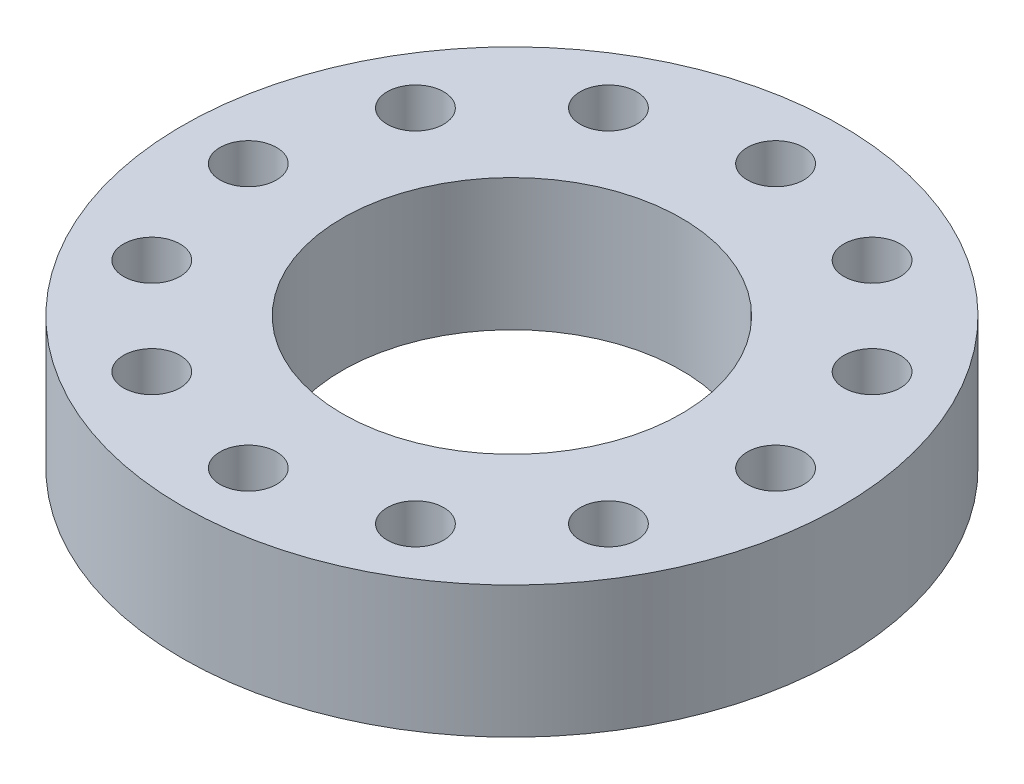
ISO-10303-21;
HEADER;
FILE_DESCRIPTION(('STEP AP214'),'2;1');
FILE_NAME('part.step','',(''),(''),'','','');
FILE_SCHEMA(('AUTOMOTIVE_DESIGN { 1 0 10303 214 1 1 1 1 }'));
ENDSEC;
DATA;
#1=APPLICATION_CONTEXT('core data for automotive mechanical design processes');
#2=APPLICATION_PROTOCOL_DEFINITION('international standard','automotive_design',2000,#1);
#3=PRODUCT_CONTEXT('',#1,'mechanical');
#4=PRODUCT('Part','Part','',(#3));
#5=PRODUCT_RELATED_PRODUCT_CATEGORY('part','',(#4));
#6=PRODUCT_DEFINITION_FORMATION('','',#4);
#7=PRODUCT_DEFINITION_CONTEXT('part definition',#1,'design');
#8=PRODUCT_DEFINITION('design','',#6,#7);
#9=PRODUCT_DEFINITION_SHAPE('','',#8);
#10=(LENGTH_UNIT() NAMED_UNIT(*) SI_UNIT(.MILLI.,.METRE.));
#11=(NAMED_UNIT(*) PLANE_ANGLE_UNIT() SI_UNIT($,.RADIAN.));
#12=(NAMED_UNIT(*) SI_UNIT($,.STERADIAN.) SOLID_ANGLE_UNIT());
#13=UNCERTAINTY_MEASURE_WITH_UNIT(LENGTH_MEASURE(1.E-05),#10,'distance_accuracy_value','');
#14=(GEOMETRIC_REPRESENTATION_CONTEXT(3) GLOBAL_UNCERTAINTY_ASSIGNED_CONTEXT((#13)) GLOBAL_UNIT_ASSIGNED_CONTEXT((#10,
#11,#12)) REPRESENTATION_CONTEXT('',''));
#15=CARTESIAN_POINT('',(0.,0.,0.));
#16=DIRECTION('',(0.,0.,1.));
#17=DIRECTION('',(1.,0.,0.));
#18=AXIS2_PLACEMENT_3D('',#15,#16,#17);
#19=CARTESIAN_POINT('',(0.,7.,0.));
#20=DIRECTION('',(0.,1.,0.));
#21=DIRECTION('',(0.,0.,1.));
#22=AXIS2_PLACEMENT_3D('',#19,#20,#21);
#23=PLANE('',#22);
#24=CARTESIAN_POINT('',(-12.1243556529818,7.,-6.99999999999942));
#25=DIRECTION('',(0.,1.,0.));
#26=DIRECTION('',(0.,0.,1.));
#27=AXIS2_PLACEMENT_3D('',#24,#25,#26);
#28=CIRCLE('',#27,1.5);
#29=CARTESIAN_POINT('',(-12.1243556529818,7.,-5.49999999999942));
#30=VERTEX_POINT('',#29);
#31=EDGE_CURVE('E107',#30,#30,#28,.T.);
#32=ORIENTED_EDGE('',*,*,#31,.F.);
#33=EDGE_LOOP('',(#32));
#34=FACE_BOUND('',#33,.T.);
#35=CARTESIAN_POINT('',(-12.1243556529812,7.,7.00000000000058));
#36=DIRECTION('',(0.,1.,0.));
#37=DIRECTION('',(0.,0.,1.));
#38=AXIS2_PLACEMENT_3D('',#35,#36,#37);
#39=CIRCLE('',#38,1.5);
#40=CARTESIAN_POINT('',(-12.1243556529812,7.,8.50000000000057));
#41=VERTEX_POINT('',#40);
#42=EDGE_CURVE('E95',#41,#41,#39,.T.);
#43=ORIENTED_EDGE('',*,*,#42,.F.);
#44=EDGE_LOOP('',(#43));
#45=FACE_BOUND('',#44,.T.);
#46=CARTESIAN_POINT('',(7.00000000000123,7.,12.1243556529818));
#47=DIRECTION('',(0.,1.,0.));
#48=DIRECTION('',(0.,0.,1.));
#49=AXIS2_PLACEMENT_3D('',#46,#47,#48);
#50=CIRCLE('',#49,1.5);
#51=CARTESIAN_POINT('',(7.00000000000123,7.,13.6243556529818));
#52=VERTEX_POINT('',#51);
#53=EDGE_CURVE('E83',#52,#52,#50,.T.);
#54=ORIENTED_EDGE('',*,*,#53,.F.);
#55=EDGE_LOOP('',(#54));
#56=FACE_BOUND('',#55,.T.);
#57=CARTESIAN_POINT('',(14.0000000000007,7.,-6.5786559193894E-13));
#58=DIRECTION('',(0.,1.,0.));
#59=DIRECTION('',(0.,0.,1.));
#60=AXIS2_PLACEMENT_3D('',#57,#58,#59);
#61=CIRCLE('',#60,1.5);
#62=CARTESIAN_POINT('',(14.0000000000007,7.,1.49999999999934));
#63=VERTEX_POINT('',#62);
#64=EDGE_CURVE('E71',#63,#63,#61,.T.);
#65=ORIENTED_EDGE('',*,*,#64,.F.);
#66=EDGE_LOOP('',(#65));
#67=FACE_BOUND('',#66,.T.);
#68=CARTESIAN_POINT('',(7.00000000000009,7.,-12.1243556529825));
#69=DIRECTION('',(0.,1.,0.));
#70=DIRECTION('',(0.,0.,1.));
#71=AXIS2_PLACEMENT_3D('',#68,#69,#70);
#72=CIRCLE('',#71,1.5);
#73=CARTESIAN_POINT('',(7.00000000000009,7.,-10.6243556529825));
#74=VERTEX_POINT('',#73);
#75=EDGE_CURVE('E59',#74,#74,#72,.T.);
#76=ORIENTED_EDGE('',*,*,#75,.F.);
#77=EDGE_LOOP('',(#76));
#78=FACE_BOUND('',#77,.T.);
#79=CARTESIAN_POINT('',(0.,7.,-14.));
#80=DIRECTION('',(0.,1.,0.));
#81=DIRECTION('',(0.,0.,1.));
#82=AXIS2_PLACEMENT_3D('',#79,#80,#81);
#83=CIRCLE('',#82,1.5);
#84=CARTESIAN_POINT('',(0.,7.,-12.5));
#85=VERTEX_POINT('',#84);
#86=EDGE_CURVE('E47',#85,#85,#83,.T.);
#87=ORIENTED_EDGE('',*,*,#86,.F.);
#88=EDGE_LOOP('',(#87));
#89=FACE_BOUND('',#88,.T.);
#90=CARTESIAN_POINT('',(0.,7.,0.));
#91=DIRECTION('',(0.,1.,0.));
#92=DIRECTION('',(0.,0.,1.));
#93=AXIS2_PLACEMENT_3D('',#90,#91,#92);
#94=CIRCLE('',#93,17.5);
#95=CARTESIAN_POINT('',(0.,7.,17.5));
#96=VERTEX_POINT('',#95);
#97=EDGE_CURVE('E10',#96,#96,#94,.T.);
#98=ORIENTED_EDGE('',*,*,#97,.T.);
#99=EDGE_LOOP('',(#98));
#100=FACE_BOUND('',#99,.T.);
#101=CARTESIAN_POINT('',(0.,7.,0.));
#102=DIRECTION('',(0.,1.,0.));
#103=DIRECTION('',(0.,0.,1.));
#104=AXIS2_PLACEMENT_3D('',#101,#102,#103);
#105=CIRCLE('',#104,9.);
#106=CARTESIAN_POINT('',(0.,7.,9.));
#107=VERTEX_POINT('',#106);
#108=EDGE_CURVE('E42',#107,#107,#105,.T.);
#109=ORIENTED_EDGE('',*,*,#108,.F.);
#110=EDGE_LOOP('',(#109));
#111=FACE_BOUND('',#110,.T.);
#112=CARTESIAN_POINT('',(1.31573118387788E-12,7.,14.));
#113=DIRECTION('',(0.,1.,0.));
#114=DIRECTION('',(0.,0.,1.));
#115=AXIS2_PLACEMENT_3D('',#112,#113,#114);
#116=CIRCLE('',#115,1.5);
#117=CARTESIAN_POINT('',(1.31573118387788E-12,7.,15.5));
#118=VERTEX_POINT('',#117);
#119=EDGE_CURVE('E53',#118,#118,#116,.T.);
#120=ORIENTED_EDGE('',*,*,#119,.F.);
#121=EDGE_LOOP('',(#120));
#122=FACE_BOUND('',#121,.T.);
#123=CARTESIAN_POINT('',(12.1243556529825,7.,-7.00000000000057));
#124=DIRECTION('',(0.,1.,0.));
#125=DIRECTION('',(0.,0.,1.));
#126=AXIS2_PLACEMENT_3D('',#123,#124,#125);
#127=CIRCLE('',#126,1.5);
#128=CARTESIAN_POINT('',(12.1243556529825,7.,-5.50000000000057));
#129=VERTEX_POINT('',#128);
#130=EDGE_CURVE('E65',#129,#129,#127,.T.);
#131=ORIENTED_EDGE('',*,*,#130,.F.);
#132=EDGE_LOOP('',(#131));
#133=FACE_BOUND('',#132,.T.);
#134=CARTESIAN_POINT('',(12.1243556529831,7.,6.99999999999943));
#135=DIRECTION('',(0.,1.,0.));
#136=DIRECTION('',(0.,0.,1.));
#137=AXIS2_PLACEMENT_3D('',#134,#135,#136);
#138=CIRCLE('',#137,1.5);
#139=CARTESIAN_POINT('',(12.1243556529831,7.,8.49999999999942));
#140=VERTEX_POINT('',#139);
#141=EDGE_CURVE('E77',#140,#140,#138,.T.);
#142=ORIENTED_EDGE('',*,*,#141,.F.);
#143=EDGE_LOOP('',(#142));
#144=FACE_BOUND('',#143,.T.);
#145=CARTESIAN_POINT('',(-6.99999999999877,7.,12.1243556529825));
#146=DIRECTION('',(0.,1.,0.));
#147=DIRECTION('',(0.,0.,1.));
#148=AXIS2_PLACEMENT_3D('',#145,#146,#147);
#149=CIRCLE('',#148,1.5);
#150=CARTESIAN_POINT('',(-6.99999999999877,7.,13.6243556529825));
#151=VERTEX_POINT('',#150);
#152=EDGE_CURVE('E89',#151,#151,#149,.T.);
#153=ORIENTED_EDGE('',*,*,#152,.F.);
#154=EDGE_LOOP('',(#153));
#155=FACE_BOUND('',#154,.T.);
#156=CARTESIAN_POINT('',(-13.9999999999993,7.,6.59580097457746E-13));
#157=DIRECTION('',(0.,1.,0.));
#158=DIRECTION('',(0.,0.,1.));
#159=AXIS2_PLACEMENT_3D('',#156,#157,#158);
#160=CIRCLE('',#159,1.5);
#161=CARTESIAN_POINT('',(-13.9999999999993,7.,1.50000000000066));
#162=VERTEX_POINT('',#161);
#163=EDGE_CURVE('E101',#162,#162,#160,.T.);
#164=ORIENTED_EDGE('',*,*,#163,.F.);
#165=EDGE_LOOP('',(#164));
#166=FACE_BOUND('',#165,.T.);
#167=CARTESIAN_POINT('',(-6.99999999999992,7.,-12.1243556529818));
#168=DIRECTION('',(0.,1.,0.));
#169=DIRECTION('',(0.,0.,1.));
#170=AXIS2_PLACEMENT_3D('',#167,#168,#169);
#171=CIRCLE('',#170,1.5);
#172=CARTESIAN_POINT('',(-6.99999999999992,7.,-10.6243556529818));
#173=VERTEX_POINT('',#172);
#174=EDGE_CURVE('E113',#173,#173,#171,.T.);
#175=ORIENTED_EDGE('',*,*,#174,.F.);
#176=EDGE_LOOP('',(#175));
#177=FACE_BOUND('',#176,.T.);
#178=ADVANCED_FACE('F31',(#34,#45,#56,#67,#78,#89,#100,#111,#122,#133,#144,#155,#166,#177),#23,.T.);
#179=CARTESIAN_POINT('',(0.,0.,0.));
#180=DIRECTION('',(0.,1.,0.));
#181=DIRECTION('',(0.,0.,1.));
#182=AXIS2_PLACEMENT_3D('',#179,#180,#181);
#183=PLANE('',#182);
#184=CARTESIAN_POINT('',(0.,0.,0.));
#185=DIRECTION('',(0.,1.,0.));
#186=DIRECTION('',(0.,0.,1.));
#187=AXIS2_PLACEMENT_3D('',#184,#185,#186);
#188=CIRCLE('',#187,17.5);
#189=CARTESIAN_POINT('',(0.,0.,17.5));
#190=VERTEX_POINT('',#189);
#191=EDGE_CURVE('E35',#190,#190,#188,.T.);
#192=ORIENTED_EDGE('',*,*,#191,.F.);
#193=EDGE_LOOP('',(#192));
#194=FACE_BOUND('',#193,.T.);
#195=CARTESIAN_POINT('',(0.,0.,0.));
#196=DIRECTION('',(0.,1.,0.));
#197=DIRECTION('',(0.,0.,1.));
#198=AXIS2_PLACEMENT_3D('',#195,#196,#197);
#199=CIRCLE('',#198,9.);
#200=CARTESIAN_POINT('',(0.,0.,9.));
#201=VERTEX_POINT('',#200);
#202=EDGE_CURVE('E44',#201,#201,#199,.T.);
#203=ORIENTED_EDGE('',*,*,#202,.T.);
#204=EDGE_LOOP('',(#203));
#205=FACE_BOUND('',#204,.T.);
#206=CARTESIAN_POINT('',(0.,0.,-14.));
#207=DIRECTION('',(0.,1.,0.));
#208=DIRECTION('',(0.,0.,1.));
#209=AXIS2_PLACEMENT_3D('',#206,#207,#208);
#210=CIRCLE('',#209,1.5);
#211=CARTESIAN_POINT('',(0.,0.,-12.5));
#212=VERTEX_POINT('',#211);
#213=EDGE_CURVE('E50',#212,#212,#210,.T.);
#214=ORIENTED_EDGE('',*,*,#213,.T.);
#215=EDGE_LOOP('',(#214));
#216=FACE_BOUND('',#215,.T.);
#217=CARTESIAN_POINT('',(1.31573118387788E-12,0.,14.));
#218=DIRECTION('',(0.,1.,0.));
#219=DIRECTION('',(0.,0.,1.));
#220=AXIS2_PLACEMENT_3D('',#217,#218,#219);
#221=CIRCLE('',#220,1.5);
#222=CARTESIAN_POINT('',(1.31573118387788E-12,0.,15.5));
#223=VERTEX_POINT('',#222);
#224=EDGE_CURVE('E56',#223,#223,#221,.T.);
#225=ORIENTED_EDGE('',*,*,#224,.T.);
#226=EDGE_LOOP('',(#225));
#227=FACE_BOUND('',#226,.T.);
#228=CARTESIAN_POINT('',(7.00000000000009,0.,-12.1243556529825));
#229=DIRECTION('',(0.,1.,0.));
#230=DIRECTION('',(0.,0.,1.));
#231=AXIS2_PLACEMENT_3D('',#228,#229,#230);
#232=CIRCLE('',#231,1.5);
#233=CARTESIAN_POINT('',(7.00000000000009,0.,-10.6243556529825));
#234=VERTEX_POINT('',#233);
#235=EDGE_CURVE('E62',#234,#234,#232,.T.);
#236=ORIENTED_EDGE('',*,*,#235,.T.);
#237=EDGE_LOOP('',(#236));
#238=FACE_BOUND('',#237,.T.);
#239=CARTESIAN_POINT('',(12.1243556529825,0.,-7.00000000000057));
#240=DIRECTION('',(0.,1.,0.));
#241=DIRECTION('',(0.,0.,1.));
#242=AXIS2_PLACEMENT_3D('',#239,#240,#241);
#243=CIRCLE('',#242,1.5);
#244=CARTESIAN_POINT('',(12.1243556529825,0.,-5.50000000000057));
#245=VERTEX_POINT('',#244);
#246=EDGE_CURVE('E68',#245,#245,#243,.T.);
#247=ORIENTED_EDGE('',*,*,#246,.T.);
#248=EDGE_LOOP('',(#247));
#249=FACE_BOUND('',#248,.T.);
#250=CARTESIAN_POINT('',(14.0000000000007,0.,-6.5786559193894E-13));
#251=DIRECTION('',(0.,1.,0.));
#252=DIRECTION('',(0.,0.,1.));
#253=AXIS2_PLACEMENT_3D('',#250,#251,#252);
#254=CIRCLE('',#253,1.5);
#255=CARTESIAN_POINT('',(14.0000000000007,0.,1.49999999999934));
#256=VERTEX_POINT('',#255);
#257=EDGE_CURVE('E74',#256,#256,#254,.T.);
#258=ORIENTED_EDGE('',*,*,#257,.T.);
#259=EDGE_LOOP('',(#258));
#260=FACE_BOUND('',#259,.T.);
#261=CARTESIAN_POINT('',(12.1243556529831,0.,6.99999999999943));
#262=DIRECTION('',(0.,1.,0.));
#263=DIRECTION('',(0.,0.,1.));
#264=AXIS2_PLACEMENT_3D('',#261,#262,#263);
#265=CIRCLE('',#264,1.5);
#266=CARTESIAN_POINT('',(12.1243556529831,0.,8.49999999999942));
#267=VERTEX_POINT('',#266);
#268=EDGE_CURVE('E80',#267,#267,#265,.T.);
#269=ORIENTED_EDGE('',*,*,#268,.T.);
#270=EDGE_LOOP('',(#269));
#271=FACE_BOUND('',#270,.T.);
#272=CARTESIAN_POINT('',(7.00000000000123,0.,12.1243556529818));
#273=DIRECTION('',(0.,1.,0.));
#274=DIRECTION('',(0.,0.,1.));
#275=AXIS2_PLACEMENT_3D('',#272,#273,#274);
#276=CIRCLE('',#275,1.5);
#277=CARTESIAN_POINT('',(7.00000000000123,0.,13.6243556529818));
#278=VERTEX_POINT('',#277);
#279=EDGE_CURVE('E86',#278,#278,#276,.T.);
#280=ORIENTED_EDGE('',*,*,#279,.T.);
#281=EDGE_LOOP('',(#280));
#282=FACE_BOUND('',#281,.T.);
#283=CARTESIAN_POINT('',(-6.99999999999877,0.,12.1243556529825));
#284=DIRECTION('',(0.,1.,0.));
#285=DIRECTION('',(0.,0.,1.));
#286=AXIS2_PLACEMENT_3D('',#283,#284,#285);
#287=CIRCLE('',#286,1.5);
#288=CARTESIAN_POINT('',(-6.99999999999877,0.,13.6243556529825));
#289=VERTEX_POINT('',#288);
#290=EDGE_CURVE('E92',#289,#289,#287,.T.);
#291=ORIENTED_EDGE('',*,*,#290,.T.);
#292=EDGE_LOOP('',(#291));
#293=FACE_BOUND('',#292,.T.);
#294=CARTESIAN_POINT('',(-12.1243556529812,0.,7.00000000000058));
#295=DIRECTION('',(0.,1.,0.));
#296=DIRECTION('',(0.,0.,1.));
#297=AXIS2_PLACEMENT_3D('',#294,#295,#296);
#298=CIRCLE('',#297,1.5);
#299=CARTESIAN_POINT('',(-12.1243556529812,0.,8.50000000000057));
#300=VERTEX_POINT('',#299);
#301=EDGE_CURVE('E98',#300,#300,#298,.T.);
#302=ORIENTED_EDGE('',*,*,#301,.T.);
#303=EDGE_LOOP('',(#302));
#304=FACE_BOUND('',#303,.T.);
#305=CARTESIAN_POINT('',(-13.9999999999993,0.,6.59580097457746E-13));
#306=DIRECTION('',(0.,1.,0.));
#307=DIRECTION('',(0.,0.,1.));
#308=AXIS2_PLACEMENT_3D('',#305,#306,#307);
#309=CIRCLE('',#308,1.5);
#310=CARTESIAN_POINT('',(-13.9999999999993,0.,1.50000000000066));
#311=VERTEX_POINT('',#310);
#312=EDGE_CURVE('E104',#311,#311,#309,.T.);
#313=ORIENTED_EDGE('',*,*,#312,.T.);
#314=EDGE_LOOP('',(#313));
#315=FACE_BOUND('',#314,.T.);
#316=CARTESIAN_POINT('',(-12.1243556529818,0.,-6.99999999999942));
#317=DIRECTION('',(0.,1.,0.));
#318=DIRECTION('',(0.,0.,1.));
#319=AXIS2_PLACEMENT_3D('',#316,#317,#318);
#320=CIRCLE('',#319,1.5);
#321=CARTESIAN_POINT('',(-12.1243556529818,0.,-5.49999999999942));
#322=VERTEX_POINT('',#321);
#323=EDGE_CURVE('E110',#322,#322,#320,.T.);
#324=ORIENTED_EDGE('',*,*,#323,.T.);
#325=EDGE_LOOP('',(#324));
#326=FACE_BOUND('',#325,.T.);
#327=CARTESIAN_POINT('',(-6.99999999999992,0.,-12.1243556529818));
#328=DIRECTION('',(0.,1.,0.));
#329=DIRECTION('',(0.,0.,1.));
#330=AXIS2_PLACEMENT_3D('',#327,#328,#329);
#331=CIRCLE('',#330,1.5);
#332=CARTESIAN_POINT('',(-6.99999999999992,0.,-10.6243556529818));
#333=VERTEX_POINT('',#332);
#334=EDGE_CURVE('E116',#333,#333,#331,.T.);
#335=ORIENTED_EDGE('',*,*,#334,.T.);
#336=EDGE_LOOP('',(#335));
#337=FACE_BOUND('',#336,.T.);
#338=ADVANCED_FACE('F126',(#194,#205,#216,#227,#238,#249,#260,#271,#282,#293,#304,#315,#326,
#337),#183,.F.);
#339=CARTESIAN_POINT('',(0.,7.,0.));
#340=DIRECTION('',(0.,-1.,0.));
#341=DIRECTION('',(0.,0.,-1.));
#342=AXIS2_PLACEMENT_3D('',#339,#340,#341);
#343=CYLINDRICAL_SURFACE('',#342,17.5);
#344=ORIENTED_EDGE('',*,*,#97,.F.);
#345=EDGE_LOOP('',(#344));
#346=FACE_BOUND('',#345,.T.);
#347=ORIENTED_EDGE('',*,*,#191,.T.);
#348=EDGE_LOOP('',(#347));
#349=FACE_BOUND('',#348,.T.);
#350=ADVANCED_FACE('F33',(#346,#349),#343,.T.);
#351=CARTESIAN_POINT('',(0.,7.,0.));
#352=DIRECTION('',(0.,-1.,0.));
#353=DIRECTION('',(0.,0.,-1.));
#354=AXIS2_PLACEMENT_3D('',#351,#352,#353);
#355=CYLINDRICAL_SURFACE('',#354,9.);
#356=ORIENTED_EDGE('',*,*,#108,.T.);
#357=EDGE_LOOP('',(#356));
#358=FACE_BOUND('',#357,.T.);
#359=ORIENTED_EDGE('',*,*,#202,.F.);
#360=EDGE_LOOP('',(#359));
#361=FACE_BOUND('',#360,.T.);
#362=ADVANCED_FACE('F136',(#358,#361),#355,.F.);
#363=CARTESIAN_POINT('',(0.,7.,-14.));
#364=DIRECTION('',(0.,-1.,0.));
#365=DIRECTION('',(0.,0.,-1.));
#366=AXIS2_PLACEMENT_3D('',#363,#364,#365);
#367=CYLINDRICAL_SURFACE('',#366,1.5);
#368=ORIENTED_EDGE('',*,*,#86,.T.);
#369=EDGE_LOOP('',(#368));
#370=FACE_BOUND('',#369,.T.);
#371=ORIENTED_EDGE('',*,*,#213,.F.);
#372=EDGE_LOOP('',(#371));
#373=FACE_BOUND('',#372,.T.);
#374=ADVANCED_FACE('F139',(#370,#373),#367,.F.);
#375=CARTESIAN_POINT('',(1.31573118387788E-12,7.,14.));
#376=DIRECTION('',(0.,-1.,0.));
#377=DIRECTION('',(0.,0.,-1.));
#378=AXIS2_PLACEMENT_3D('',#375,#376,#377);
#379=CYLINDRICAL_SURFACE('',#378,1.5);
#380=ORIENTED_EDGE('',*,*,#119,.T.);
#381=EDGE_LOOP('',(#380));
#382=FACE_BOUND('',#381,.T.);
#383=ORIENTED_EDGE('',*,*,#224,.F.);
#384=EDGE_LOOP('',(#383));
#385=FACE_BOUND('',#384,.T.);
#386=ADVANCED_FACE('F143',(#382,#385),#379,.F.);
#387=CARTESIAN_POINT('',(7.00000000000009,7.,-12.1243556529825));
#388=DIRECTION('',(0.,-1.,0.));
#389=DIRECTION('',(0.,0.,-1.));
#390=AXIS2_PLACEMENT_3D('',#387,#388,#389);
#391=CYLINDRICAL_SURFACE('',#390,1.5);
#392=ORIENTED_EDGE('',*,*,#75,.T.);
#393=EDGE_LOOP('',(#392));
#394=FACE_BOUND('',#393,.T.);
#395=ORIENTED_EDGE('',*,*,#235,.F.);
#396=EDGE_LOOP('',(#395));
#397=FACE_BOUND('',#396,.T.);
#398=ADVANCED_FACE('F147',(#394,#397),#391,.F.);
#399=CARTESIAN_POINT('',(12.1243556529825,7.,-7.00000000000057));
#400=DIRECTION('',(0.,-1.,0.));
#401=DIRECTION('',(0.,0.,-1.));
#402=AXIS2_PLACEMENT_3D('',#399,#400,#401);
#403=CYLINDRICAL_SURFACE('',#402,1.5);
#404=ORIENTED_EDGE('',*,*,#130,.T.);
#405=EDGE_LOOP('',(#404));
#406=FACE_BOUND('',#405,.T.);
#407=ORIENTED_EDGE('',*,*,#246,.F.);
#408=EDGE_LOOP('',(#407));
#409=FACE_BOUND('',#408,.T.);
#410=ADVANCED_FACE('F151',(#406,#409),#403,.F.);
#411=CARTESIAN_POINT('',(14.0000000000007,7.,-6.5786559193894E-13));
#412=DIRECTION('',(0.,-1.,0.));
#413=DIRECTION('',(0.,0.,-1.));
#414=AXIS2_PLACEMENT_3D('',#411,#412,#413);
#415=CYLINDRICAL_SURFACE('',#414,1.5);
#416=ORIENTED_EDGE('',*,*,#64,.T.);
#417=EDGE_LOOP('',(#416));
#418=FACE_BOUND('',#417,.T.);
#419=ORIENTED_EDGE('',*,*,#257,.F.);
#420=EDGE_LOOP('',(#419));
#421=FACE_BOUND('',#420,.T.);
#422=ADVANCED_FACE('F155',(#418,#421),#415,.F.);
#423=CARTESIAN_POINT('',(12.1243556529831,7.,6.99999999999943));
#424=DIRECTION('',(0.,-1.,0.));
#425=DIRECTION('',(0.,0.,-1.));
#426=AXIS2_PLACEMENT_3D('',#423,#424,#425);
#427=CYLINDRICAL_SURFACE('',#426,1.5);
#428=ORIENTED_EDGE('',*,*,#141,.T.);
#429=EDGE_LOOP('',(#428));
#430=FACE_BOUND('',#429,.T.);
#431=ORIENTED_EDGE('',*,*,#268,.F.);
#432=EDGE_LOOP('',(#431));
#433=FACE_BOUND('',#432,.T.);
#434=ADVANCED_FACE('F159',(#430,#433),#427,.F.);
#435=CARTESIAN_POINT('',(7.00000000000123,7.,12.1243556529818));
#436=DIRECTION('',(0.,-1.,0.));
#437=DIRECTION('',(0.,0.,-1.));
#438=AXIS2_PLACEMENT_3D('',#435,#436,#437);
#439=CYLINDRICAL_SURFACE('',#438,1.5);
#440=ORIENTED_EDGE('',*,*,#53,.T.);
#441=EDGE_LOOP('',(#440));
#442=FACE_BOUND('',#441,.T.);
#443=ORIENTED_EDGE('',*,*,#279,.F.);
#444=EDGE_LOOP('',(#443));
#445=FACE_BOUND('',#444,.T.);
#446=ADVANCED_FACE('F163',(#442,#445),#439,.F.);
#447=CARTESIAN_POINT('',(-6.99999999999877,7.,12.1243556529825));
#448=DIRECTION('',(0.,-1.,0.));
#449=DIRECTION('',(0.,0.,-1.));
#450=AXIS2_PLACEMENT_3D('',#447,#448,#449);
#451=CYLINDRICAL_SURFACE('',#450,1.5);
#452=ORIENTED_EDGE('',*,*,#152,.T.);
#453=EDGE_LOOP('',(#452));
#454=FACE_BOUND('',#453,.T.);
#455=ORIENTED_EDGE('',*,*,#290,.F.);
#456=EDGE_LOOP('',(#455));
#457=FACE_BOUND('',#456,.T.);
#458=ADVANCED_FACE('F167',(#454,#457),#451,.F.);
#459=CARTESIAN_POINT('',(-12.1243556529812,7.,7.00000000000058));
#460=DIRECTION('',(0.,-1.,0.));
#461=DIRECTION('',(0.,0.,-1.));
#462=AXIS2_PLACEMENT_3D('',#459,#460,#461);
#463=CYLINDRICAL_SURFACE('',#462,1.5);
#464=ORIENTED_EDGE('',*,*,#42,.T.);
#465=EDGE_LOOP('',(#464));
#466=FACE_BOUND('',#465,.T.);
#467=ORIENTED_EDGE('',*,*,#301,.F.);
#468=EDGE_LOOP('',(#467));
#469=FACE_BOUND('',#468,.T.);
#470=ADVANCED_FACE('F171',(#466,#469),#463,.F.);
#471=CARTESIAN_POINT('',(-13.9999999999993,7.,6.59580097457746E-13));
#472=DIRECTION('',(0.,-1.,0.));
#473=DIRECTION('',(0.,0.,-1.));
#474=AXIS2_PLACEMENT_3D('',#471,#472,#473);
#475=CYLINDRICAL_SURFACE('',#474,1.5);
#476=ORIENTED_EDGE('',*,*,#163,.T.);
#477=EDGE_LOOP('',(#476));
#478=FACE_BOUND('',#477,.T.);
#479=ORIENTED_EDGE('',*,*,#312,.F.);
#480=EDGE_LOOP('',(#479));
#481=FACE_BOUND('',#480,.T.);
#482=ADVANCED_FACE('F175',(#478,#481),#475,.F.);
#483=CARTESIAN_POINT('',(-12.1243556529818,7.,-6.99999999999942));
#484=DIRECTION('',(0.,-1.,0.));
#485=DIRECTION('',(0.,0.,-1.));
#486=AXIS2_PLACEMENT_3D('',#483,#484,#485);
#487=CYLINDRICAL_SURFACE('',#486,1.5);
#488=ORIENTED_EDGE('',*,*,#31,.T.);
#489=EDGE_LOOP('',(#488));
#490=FACE_BOUND('',#489,.T.);
#491=ORIENTED_EDGE('',*,*,#323,.F.);
#492=EDGE_LOOP('',(#491));
#493=FACE_BOUND('',#492,.T.);
#494=ADVANCED_FACE('F179',(#490,#493),#487,.F.);
#495=CARTESIAN_POINT('',(-6.99999999999992,7.,-12.1243556529818));
#496=DIRECTION('',(0.,-1.,0.));
#497=DIRECTION('',(0.,0.,-1.));
#498=AXIS2_PLACEMENT_3D('',#495,#496,#497);
#499=CYLINDRICAL_SURFACE('',#498,1.5);
#500=ORIENTED_EDGE('',*,*,#174,.T.);
#501=EDGE_LOOP('',(#500));
#502=FACE_BOUND('',#501,.T.);
#503=ORIENTED_EDGE('',*,*,#334,.F.);
#504=EDGE_LOOP('',(#503));
#505=FACE_BOUND('',#504,.T.);
#506=ADVANCED_FACE('F122',(#502,#505),#499,.F.);
#507=CLOSED_SHELL('',(#178,#338,#350,#362,#374,#386,#398,#410,#422,#434,#446,#458,#470,#482,
#494,#506));
#508=MANIFOLD_SOLID_BREP('B2',#507);
#509=ADVANCED_BREP_SHAPE_REPRESENTATION('',(#18,#508),#14);
#510=SHAPE_DEFINITION_REPRESENTATION(#9,#509);
ENDSEC;
END-ISO-10303-21;
